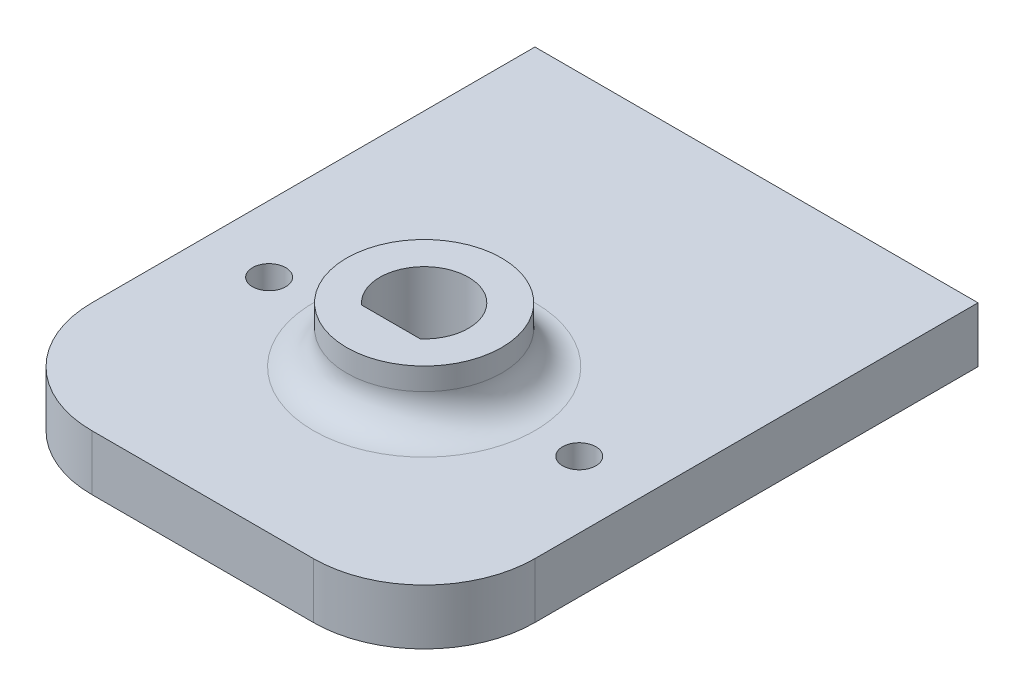
ISO-10303-21;
HEADER;
FILE_DESCRIPTION(('STEP AP214'),'2;1');
FILE_NAME('part.step','',(''),(''),'','','');
FILE_SCHEMA(('AUTOMOTIVE_DESIGN { 1 0 10303 214 1 1 1 1 }'));
ENDSEC;
DATA;
#1=APPLICATION_CONTEXT('core data for automotive mechanical design processes');
#2=APPLICATION_PROTOCOL_DEFINITION('international standard','automotive_design',2000,#1);
#3=PRODUCT_CONTEXT('',#1,'mechanical');
#4=PRODUCT('Part','Part','',(#3));
#5=PRODUCT_RELATED_PRODUCT_CATEGORY('part','',(#4));
#6=PRODUCT_DEFINITION_FORMATION('','',#4);
#7=PRODUCT_DEFINITION_CONTEXT('part definition',#1,'design');
#8=PRODUCT_DEFINITION('design','',#6,#7);
#9=PRODUCT_DEFINITION_SHAPE('','',#8);
#10=(LENGTH_UNIT() NAMED_UNIT(*) SI_UNIT(.MILLI.,.METRE.));
#11=(NAMED_UNIT(*) PLANE_ANGLE_UNIT() SI_UNIT($,.RADIAN.));
#12=(NAMED_UNIT(*) SI_UNIT($,.STERADIAN.) SOLID_ANGLE_UNIT());
#13=UNCERTAINTY_MEASURE_WITH_UNIT(LENGTH_MEASURE(1.E-05),#10,'distance_accuracy_value','');
#14=(GEOMETRIC_REPRESENTATION_CONTEXT(3) GLOBAL_UNCERTAINTY_ASSIGNED_CONTEXT((#13)) GLOBAL_UNIT_ASSIGNED_CONTEXT((#10,
#11,#12)) REPRESENTATION_CONTEXT('',''));
#15=CARTESIAN_POINT('',(0.,0.,0.));
#16=DIRECTION('',(0.,0.,1.));
#17=DIRECTION('',(1.,0.,0.));
#18=AXIS2_PLACEMENT_3D('',#15,#16,#17);
#19=CARTESIAN_POINT('',(0.,5.,0.));
#20=DIRECTION('',(0.,1.,0.));
#21=DIRECTION('',(0.,0.,1.));
#22=AXIS2_PLACEMENT_3D('',#19,#20,#21);
#23=PLANE('',#22);
#24=CARTESIAN_POINT('',(0.,5.,0.));
#25=DIRECTION('',(0.,1.,0.));
#26=DIRECTION('',(0.,0.,1.));
#27=AXIS2_PLACEMENT_3D('',#24,#25,#26);
#28=CIRCLE('',#27,10.);
#29=CARTESIAN_POINT('',(0.,5.,10.));
#30=VERTEX_POINT('',#29);
#31=EDGE_CURVE('E11',#30,#30,#28,.F.);
#32=ORIENTED_EDGE('',*,*,#31,.T.);
#33=EDGE_LOOP('',(#32));
#34=FACE_BOUND('',#33,.T.);
#35=CARTESIAN_POINT('',(14.,5.,0.));
#36=DIRECTION('',(0.,1.,0.));
#37=DIRECTION('',(0.,0.,1.));
#38=AXIS2_PLACEMENT_3D('',#35,#36,#37);
#39=CIRCLE('',#38,1.5);
#40=CARTESIAN_POINT('',(14.,5.,1.5));
#41=VERTEX_POINT('',#40);
#42=EDGE_CURVE('E141',#41,#41,#39,.T.);
#43=ORIENTED_EDGE('',*,*,#42,.F.);
#44=EDGE_LOOP('',(#43));
#45=FACE_BOUND('',#44,.T.);
#46=DIRECTION('',(1.,0.,0.));
#47=VECTOR('',#46,1.);
#48=CARTESIAN_POINT('',(-20.,5.,20.));
#49=LINE('',#48,#47);
#50=CARTESIAN_POINT('',(-10.,5.,20.));
#51=VERTEX_POINT('',#50);
#52=CARTESIAN_POINT('',(10.,5.,20.));
#53=VERTEX_POINT('',#52);
#54=EDGE_CURVE('E154',#51,#53,#49,.T.);
#55=ORIENTED_EDGE('',*,*,#54,.T.);
#56=CARTESIAN_POINT('',(10.,5.,10.));
#57=DIRECTION('',(0.,1.,0.));
#58=DIRECTION('',(0.,0.,1.));
#59=AXIS2_PLACEMENT_3D('',#56,#57,#58);
#60=CIRCLE('',#59,10.);
#61=CARTESIAN_POINT('',(20.,5.,10.));
#62=VERTEX_POINT('',#61);
#63=EDGE_CURVE('E182',#53,#62,#60,.T.);
#64=ORIENTED_EDGE('',*,*,#63,.T.);
#65=DIRECTION('',(0.,0.,-1.));
#66=VECTOR('',#65,1.);
#67=CARTESIAN_POINT('',(20.,5.,-20.));
#68=LINE('',#67,#66);
#69=CARTESIAN_POINT('',(20.,5.,-30.));
#70=VERTEX_POINT('',#69);
#71=EDGE_CURVE('E147',#62,#70,#68,.T.);
#72=ORIENTED_EDGE('',*,*,#71,.T.);
#73=DIRECTION('',(-1.,0.,0.));
#74=VECTOR('',#73,1.);
#75=CARTESIAN_POINT('',(-20.,5.,-30.));
#76=LINE('',#75,#74);
#77=CARTESIAN_POINT('',(-20.,5.,-30.));
#78=VERTEX_POINT('',#77);
#79=EDGE_CURVE('E149',#70,#78,#76,.T.);
#80=ORIENTED_EDGE('',*,*,#79,.T.);
#81=DIRECTION('',(0.,0.,1.));
#82=VECTOR('',#81,1.);
#83=CARTESIAN_POINT('',(-20.,5.,-20.));
#84=LINE('',#83,#82);
#85=CARTESIAN_POINT('',(-20.,5.,10.));
#86=VERTEX_POINT('',#85);
#87=EDGE_CURVE('E152',#78,#86,#84,.T.);
#88=ORIENTED_EDGE('',*,*,#87,.T.);
#89=CARTESIAN_POINT('',(-10.,5.,10.));
#90=DIRECTION('',(0.,1.,0.));
#91=DIRECTION('',(0.,0.,1.));
#92=AXIS2_PLACEMENT_3D('',#89,#90,#91);
#93=CIRCLE('',#92,10.);
#94=EDGE_CURVE('E180',#86,#51,#93,.T.);
#95=ORIENTED_EDGE('',*,*,#94,.T.);
#96=EDGE_LOOP('',(#55,#64,#72,#80,#88,#95));
#97=FACE_BOUND('',#96,.T.);
#98=CARTESIAN_POINT('',(-14.,5.,0.));
#99=DIRECTION('',(0.,1.,0.));
#100=DIRECTION('',(0.,0.,1.));
#101=AXIS2_PLACEMENT_3D('',#98,#99,#100);
#102=CIRCLE('',#101,1.5);
#103=CARTESIAN_POINT('',(-14.,5.,1.5));
#104=VERTEX_POINT('',#103);
#105=EDGE_CURVE('E135',#104,#104,#102,.T.);
#106=ORIENTED_EDGE('',*,*,#105,.F.);
#107=EDGE_LOOP('',(#106));
#108=FACE_BOUND('',#107,.T.);
#109=ADVANCED_FACE('F37',(#34,#45,#97,#108),#23,.T.);
#110=CARTESIAN_POINT('',(0.,0.,0.));
#111=DIRECTION('',(0.,1.,0.));
#112=DIRECTION('',(0.,0.,1.));
#113=AXIS2_PLACEMENT_3D('',#110,#111,#112);
#114=PLANE('',#113);
#115=CARTESIAN_POINT('',(-14.,0.,0.));
#116=DIRECTION('',(0.,1.,0.));
#117=DIRECTION('',(0.,0.,1.));
#118=AXIS2_PLACEMENT_3D('',#115,#116,#117);
#119=CIRCLE('',#118,1.5);
#120=CARTESIAN_POINT('',(-14.,0.,1.5));
#121=VERTEX_POINT('',#120);
#122=EDGE_CURVE('E134',#121,#121,#119,.T.);
#123=ORIENTED_EDGE('',*,*,#122,.T.);
#124=EDGE_LOOP('',(#123));
#125=FACE_BOUND('',#124,.T.);
#126=CARTESIAN_POINT('',(14.,0.,0.));
#127=DIRECTION('',(0.,1.,0.));
#128=DIRECTION('',(0.,0.,1.));
#129=AXIS2_PLACEMENT_3D('',#126,#127,#128);
#130=CIRCLE('',#129,1.5);
#131=CARTESIAN_POINT('',(14.,0.,1.5));
#132=VERTEX_POINT('',#131);
#133=EDGE_CURVE('E138',#132,#132,#130,.T.);
#134=ORIENTED_EDGE('',*,*,#133,.T.);
#135=EDGE_LOOP('',(#134));
#136=FACE_BOUND('',#135,.T.);
#137=DIRECTION('',(0.,0.,-1.));
#138=VECTOR('',#137,1.);
#139=CARTESIAN_POINT('',(20.,0.,-20.));
#140=LINE('',#139,#138);
#141=CARTESIAN_POINT('',(20.,0.,10.));
#142=VERTEX_POINT('',#141);
#143=CARTESIAN_POINT('',(20.,0.,-30.));
#144=VERTEX_POINT('',#143);
#145=EDGE_CURVE('E144',#142,#144,#140,.T.);
#146=ORIENTED_EDGE('',*,*,#145,.F.);
#147=CARTESIAN_POINT('',(10.,0.,10.));
#148=DIRECTION('',(0.,1.,0.));
#149=DIRECTION('',(0.,0.,1.));
#150=AXIS2_PLACEMENT_3D('',#147,#148,#149);
#151=CIRCLE('',#150,10.);
#152=CARTESIAN_POINT('',(10.,0.,20.));
#153=VERTEX_POINT('',#152);
#154=EDGE_CURVE('E174',#142,#153,#151,.F.);
#155=ORIENTED_EDGE('',*,*,#154,.T.);
#156=DIRECTION('',(1.,0.,0.));
#157=VECTOR('',#156,1.);
#158=CARTESIAN_POINT('',(-20.,0.,20.));
#159=LINE('',#158,#157);
#160=CARTESIAN_POINT('',(-10.,0.,20.));
#161=VERTEX_POINT('',#160);
#162=EDGE_CURVE('E150',#161,#153,#159,.T.);
#163=ORIENTED_EDGE('',*,*,#162,.F.);
#164=CARTESIAN_POINT('',(-10.,0.,10.));
#165=DIRECTION('',(0.,1.,0.));
#166=DIRECTION('',(0.,0.,1.));
#167=AXIS2_PLACEMENT_3D('',#164,#165,#166);
#168=CIRCLE('',#167,10.);
#169=CARTESIAN_POINT('',(-20.,0.,10.));
#170=VERTEX_POINT('',#169);
#171=EDGE_CURVE('E172',#161,#170,#168,.F.);
#172=ORIENTED_EDGE('',*,*,#171,.T.);
#173=DIRECTION('',(0.,0.,1.));
#174=VECTOR('',#173,1.);
#175=CARTESIAN_POINT('',(-20.,0.,-20.));
#176=LINE('',#175,#174);
#177=CARTESIAN_POINT('',(-20.,0.,-30.));
#178=VERTEX_POINT('',#177);
#179=EDGE_CURVE('E161',#178,#170,#176,.T.);
#180=ORIENTED_EDGE('',*,*,#179,.F.);
#181=DIRECTION('',(-1.,0.,0.));
#182=VECTOR('',#181,1.);
#183=CARTESIAN_POINT('',(-20.,0.,-30.));
#184=LINE('',#183,#182);
#185=EDGE_CURVE('E158',#144,#178,#184,.T.);
#186=ORIENTED_EDGE('',*,*,#185,.F.);
#187=EDGE_LOOP('',(#146,#155,#163,#172,#180,#186));
#188=FACE_BOUND('',#187,.T.);
#189=CARTESIAN_POINT('',(0.,0.,0.));
#190=DIRECTION('',(0.,1.,0.));
#191=DIRECTION('',(0.,0.,-1.));
#192=AXIS2_PLACEMENT_3D('',#189,#190,#191);
#193=CIRCLE('',#192,4.);
#194=CARTESIAN_POINT('',(2.64575131106459,0.,3.));
#195=VERTEX_POINT('',#194);
#196=CARTESIAN_POINT('',(-2.64575131106459,0.,3.));
#197=VERTEX_POINT('',#196);
#198=EDGE_CURVE('E113',#195,#197,#193,.T.);
#199=ORIENTED_EDGE('',*,*,#198,.T.);
#200=DIRECTION('',(1.,0.,0.));
#201=VECTOR('',#200,1.);
#202=CARTESIAN_POINT('',(-2.64575131106459,0.,3.));
#203=LINE('',#202,#201);
#204=EDGE_CURVE('E117',#197,#195,#203,.T.);
#205=ORIENTED_EDGE('',*,*,#204,.T.);
#206=EDGE_LOOP('',(#199,#205));
#207=FACE_BOUND('',#206,.T.);
#208=ADVANCED_FACE('F200',(#125,#136,#188,#207),#114,.F.);
#209=CARTESIAN_POINT('',(20.,5.,-20.));
#210=DIRECTION('',(-1.,0.,0.));
#211=DIRECTION('',(0.,0.,1.));
#212=AXIS2_PLACEMENT_3D('',#209,#210,#211);
#213=PLANE('',#212);
#214=ORIENTED_EDGE('',*,*,#71,.F.);
#215=DIRECTION('',(0.,-1.,0.));
#216=VECTOR('',#215,1.);
#217=CARTESIAN_POINT('',(20.,5.,10.));
#218=LINE('',#217,#216);
#219=EDGE_CURVE('E169',#62,#142,#218,.T.);
#220=ORIENTED_EDGE('',*,*,#219,.T.);
#221=ORIENTED_EDGE('',*,*,#145,.T.);
#222=DIRECTION('',(0.,-1.,0.));
#223=VECTOR('',#222,1.);
#224=CARTESIAN_POINT('',(20.,5.,-30.));
#225=LINE('',#224,#223);
#226=EDGE_CURVE('E166',#70,#144,#225,.T.);
#227=ORIENTED_EDGE('',*,*,#226,.F.);
#228=EDGE_LOOP('',(#214,#220,#221,#227));
#229=FACE_BOUND('',#228,.T.);
#230=ADVANCED_FACE('F206',(#229),#213,.F.);
#231=CARTESIAN_POINT('',(-20.,5.,-30.));
#232=DIRECTION('',(0.,0.,1.));
#233=DIRECTION('',(1.,0.,0.));
#234=AXIS2_PLACEMENT_3D('',#231,#232,#233);
#235=PLANE('',#234);
#236=ORIENTED_EDGE('',*,*,#185,.T.);
#237=DIRECTION('',(0.,-1.,0.));
#238=VECTOR('',#237,1.);
#239=CARTESIAN_POINT('',(-20.,5.,-30.));
#240=LINE('',#239,#238);
#241=EDGE_CURVE('E156',#78,#178,#240,.T.);
#242=ORIENTED_EDGE('',*,*,#241,.F.);
#243=ORIENTED_EDGE('',*,*,#79,.F.);
#244=ORIENTED_EDGE('',*,*,#226,.T.);
#245=EDGE_LOOP('',(#236,#242,#243,#244));
#246=FACE_BOUND('',#245,.T.);
#247=ADVANCED_FACE('F220',(#246),#235,.F.);
#248=CARTESIAN_POINT('',(-20.,5.,-20.));
#249=DIRECTION('',(1.,0.,0.));
#250=DIRECTION('',(0.,0.,-1.));
#251=AXIS2_PLACEMENT_3D('',#248,#249,#250);
#252=PLANE('',#251);
#253=ORIENTED_EDGE('',*,*,#179,.T.);
#254=DIRECTION('',(0.,-1.,0.));
#255=VECTOR('',#254,1.);
#256=CARTESIAN_POINT('',(-20.,5.,10.));
#257=LINE('',#256,#255);
#258=EDGE_CURVE('E52',#170,#86,#257,.F.);
#259=ORIENTED_EDGE('',*,*,#258,.T.);
#260=ORIENTED_EDGE('',*,*,#87,.F.);
#261=ORIENTED_EDGE('',*,*,#241,.T.);
#262=EDGE_LOOP('',(#253,#259,#260,#261));
#263=FACE_BOUND('',#262,.T.);
#264=ADVANCED_FACE('F217',(#263),#252,.F.);
#265=CARTESIAN_POINT('',(-20.,5.,20.));
#266=DIRECTION('',(0.,0.,-1.));
#267=DIRECTION('',(-1.,0.,0.));
#268=AXIS2_PLACEMENT_3D('',#265,#266,#267);
#269=PLANE('',#268);
#270=ORIENTED_EDGE('',*,*,#162,.T.);
#271=DIRECTION('',(0.,-1.,0.));
#272=VECTOR('',#271,1.);
#273=CARTESIAN_POINT('',(10.,5.,20.));
#274=LINE('',#273,#272);
#275=EDGE_CURVE('E60',#153,#53,#274,.F.);
#276=ORIENTED_EDGE('',*,*,#275,.T.);
#277=ORIENTED_EDGE('',*,*,#54,.F.);
#278=DIRECTION('',(0.,-1.,0.));
#279=VECTOR('',#278,1.);
#280=CARTESIAN_POINT('',(-10.,5.,20.));
#281=LINE('',#280,#279);
#282=EDGE_CURVE('E176',#51,#161,#281,.T.);
#283=ORIENTED_EDGE('',*,*,#282,.T.);
#284=EDGE_LOOP('',(#270,#276,#277,#283));
#285=FACE_BOUND('',#284,.T.);
#286=ADVANCED_FACE('F214',(#285),#269,.F.);
#287=CARTESIAN_POINT('',(14.,5.,0.));
#288=DIRECTION('',(0.,-1.,0.));
#289=DIRECTION('',(0.,0.,-1.));
#290=AXIS2_PLACEMENT_3D('',#287,#288,#289);
#291=CYLINDRICAL_SURFACE('',#290,1.5);
#292=ORIENTED_EDGE('',*,*,#42,.T.);
#293=EDGE_LOOP('',(#292));
#294=FACE_BOUND('',#293,.T.);
#295=ORIENTED_EDGE('',*,*,#133,.F.);
#296=EDGE_LOOP('',(#295));
#297=FACE_BOUND('',#296,.T.);
#298=ADVANCED_FACE('F211',(#294,#297),#291,.F.);
#299=CARTESIAN_POINT('',(-14.,5.,0.));
#300=DIRECTION('',(0.,-1.,0.));
#301=DIRECTION('',(0.,0.,-1.));
#302=AXIS2_PLACEMENT_3D('',#299,#300,#301);
#303=CYLINDRICAL_SURFACE('',#302,1.5);
#304=ORIENTED_EDGE('',*,*,#105,.T.);
#305=EDGE_LOOP('',(#304));
#306=FACE_BOUND('',#305,.T.);
#307=ORIENTED_EDGE('',*,*,#122,.F.);
#308=EDGE_LOOP('',(#307));
#309=FACE_BOUND('',#308,.T.);
#310=ADVANCED_FACE('F250',(#306,#309),#303,.F.);
#311=CARTESIAN_POINT('',(0.,5.,0.));
#312=DIRECTION('',(0.,-1.,0.));
#313=DIRECTION('',(0.,0.,-1.));
#314=AXIS2_PLACEMENT_3D('',#311,#312,#313);
#315=CYLINDRICAL_SURFACE('',#314,4.);
#316=ORIENTED_EDGE('',*,*,#198,.F.);
#317=DIRECTION('',(0.,-1.,0.));
#318=VECTOR('',#317,1.);
#319=CARTESIAN_POINT('',(2.64575131106459,5.,3.));
#320=LINE('',#319,#318);
#321=CARTESIAN_POINT('',(2.64575131106458,10.,3.));
#322=VERTEX_POINT('',#321);
#323=EDGE_CURVE('E106',#322,#195,#320,.T.);
#324=ORIENTED_EDGE('',*,*,#323,.F.);
#325=CARTESIAN_POINT('',(0.,10.,0.));
#326=DIRECTION('',(0.,1.,0.));
#327=DIRECTION('',(0.,0.,1.));
#328=AXIS2_PLACEMENT_3D('',#325,#326,#327);
#329=CIRCLE('',#328,4.);
#330=CARTESIAN_POINT('',(-2.64575131106458,10.,3.));
#331=VERTEX_POINT('',#330);
#332=EDGE_CURVE('E111',#331,#322,#329,.F.);
#333=ORIENTED_EDGE('',*,*,#332,.F.);
#334=DIRECTION('',(0.,-1.,0.));
#335=VECTOR('',#334,1.);
#336=CARTESIAN_POINT('',(-2.64575131106459,5.,3.));
#337=LINE('',#336,#335);
#338=EDGE_CURVE('E116',#331,#197,#337,.T.);
#339=ORIENTED_EDGE('',*,*,#338,.T.);
#340=EDGE_LOOP('',(#316,#324,#333,#339));
#341=FACE_BOUND('',#340,.T.);
#342=ADVANCED_FACE('F108',(#341),#315,.F.);
#343=CARTESIAN_POINT('',(-2.64575131106459,5.,3.));
#344=DIRECTION('',(0.,0.,-1.));
#345=DIRECTION('',(-1.,0.,0.));
#346=AXIS2_PLACEMENT_3D('',#343,#344,#345);
#347=PLANE('',#346);
#348=ORIENTED_EDGE('',*,*,#204,.F.);
#349=ORIENTED_EDGE('',*,*,#338,.F.);
#350=DIRECTION('',(-1.,0.,0.));
#351=VECTOR('',#350,1.);
#352=CARTESIAN_POINT('',(0.,10.,3.));
#353=LINE('',#352,#351);
#354=EDGE_CURVE('E120',#322,#331,#353,.T.);
#355=ORIENTED_EDGE('',*,*,#354,.F.);
#356=ORIENTED_EDGE('',*,*,#323,.T.);
#357=EDGE_LOOP('',(#348,#349,#355,#356));
#358=FACE_BOUND('',#357,.T.);
#359=ADVANCED_FACE('F121',(#358),#347,.T.);
#360=CARTESIAN_POINT('',(0.,10.,0.));
#361=DIRECTION('',(0.,-1.,0.));
#362=DIRECTION('',(0.,0.,-1.));
#363=AXIS2_PLACEMENT_3D('',#360,#361,#362);
#364=CYLINDRICAL_SURFACE('',#363,7.);
#365=CARTESIAN_POINT('',(0.,8.,0.));
#366=DIRECTION('',(0.,1.,0.));
#367=DIRECTION('',(0.,0.,1.));
#368=AXIS2_PLACEMENT_3D('',#365,#366,#367);
#369=CIRCLE('',#368,7.);
#370=CARTESIAN_POINT('',(0.,8.,7.));
#371=VERTEX_POINT('',#370);
#372=EDGE_CURVE('E45',#371,#371,#369,.T.);
#373=ORIENTED_EDGE('',*,*,#372,.T.);
#374=EDGE_LOOP('',(#373));
#375=FACE_BOUND('',#374,.T.);
#376=CARTESIAN_POINT('',(0.,10.,0.));
#377=DIRECTION('',(0.,1.,0.));
#378=DIRECTION('',(0.,0.,1.));
#379=AXIS2_PLACEMENT_3D('',#376,#377,#378);
#380=CIRCLE('',#379,7.);
#381=CARTESIAN_POINT('',(0.,10.,7.));
#382=VERTEX_POINT('',#381);
#383=EDGE_CURVE('E123',#382,#382,#380,.T.);
#384=ORIENTED_EDGE('',*,*,#383,.F.);
#385=EDGE_LOOP('',(#384));
#386=FACE_BOUND('',#385,.T.);
#387=ADVANCED_FACE('F187',(#375,#386),#364,.T.);
#388=CARTESIAN_POINT('',(0.,10.,0.));
#389=DIRECTION('',(0.,1.,0.));
#390=DIRECTION('',(0.,0.,1.));
#391=AXIS2_PLACEMENT_3D('',#388,#389,#390);
#392=PLANE('',#391);
#393=ORIENTED_EDGE('',*,*,#332,.T.);
#394=ORIENTED_EDGE('',*,*,#354,.T.);
#395=EDGE_LOOP('',(#393,#394));
#396=FACE_BOUND('',#395,.T.);
#397=ORIENTED_EDGE('',*,*,#383,.T.);
#398=EDGE_LOOP('',(#397));
#399=FACE_BOUND('',#398,.T.);
#400=ADVANCED_FACE('F125',(#396,#399),#392,.T.);
#401=CARTESIAN_POINT('',(10.,5.,10.));
#402=DIRECTION('',(0.,-1.,0.));
#403=DIRECTION('',(0.,0.,-1.));
#404=AXIS2_PLACEMENT_3D('',#401,#402,#403);
#405=CYLINDRICAL_SURFACE('',#404,10.);
#406=ORIENTED_EDGE('',*,*,#63,.F.);
#407=ORIENTED_EDGE('',*,*,#275,.F.);
#408=ORIENTED_EDGE('',*,*,#154,.F.);
#409=ORIENTED_EDGE('',*,*,#219,.F.);
#410=EDGE_LOOP('',(#406,#407,#408,#409));
#411=FACE_BOUND('',#410,.T.);
#412=ADVANCED_FACE('F196',(#411),#405,.T.);
#413=CARTESIAN_POINT('',(-10.,5.,10.));
#414=DIRECTION('',(0.,-1.,0.));
#415=DIRECTION('',(0.,0.,-1.));
#416=AXIS2_PLACEMENT_3D('',#413,#414,#415);
#417=CYLINDRICAL_SURFACE('',#416,10.);
#418=ORIENTED_EDGE('',*,*,#94,.F.);
#419=ORIENTED_EDGE('',*,*,#258,.F.);
#420=ORIENTED_EDGE('',*,*,#171,.F.);
#421=ORIENTED_EDGE('',*,*,#282,.F.);
#422=EDGE_LOOP('',(#418,#419,#420,#421));
#423=FACE_BOUND('',#422,.T.);
#424=ADVANCED_FACE('F191',(#423),#417,.T.);
#425=CARTESIAN_POINT('',(0.,8.,0.));
#426=DIRECTION('',(0.,1.,0.));
#427=DIRECTION('',(0.,0.,1.));
#428=AXIS2_PLACEMENT_3D('',#425,#426,#427);
#429=TOROIDAL_SURFACE('',#428,10.,3.);
#430=ORIENTED_EDGE('',*,*,#31,.F.);
#431=EDGE_LOOP('',(#430));
#432=FACE_BOUND('',#431,.T.);
#433=ORIENTED_EDGE('',*,*,#372,.F.);
#434=EDGE_LOOP('',(#433));
#435=FACE_BOUND('',#434,.T.);
#436=ADVANCED_FACE('F39',(#432,#435),#429,.F.);
#437=CLOSED_SHELL('',(#109,#208,#230,#247,#264,#286,#298,#310,#342,#359,#387,#400,#412,#424,#436));
#438=MANIFOLD_SOLID_BREP('B2',#437);
#439=ADVANCED_BREP_SHAPE_REPRESENTATION('',(#18,#438),#14);
#440=SHAPE_DEFINITION_REPRESENTATION(#9,#439);
ENDSEC;
END-ISO-10303-21;
